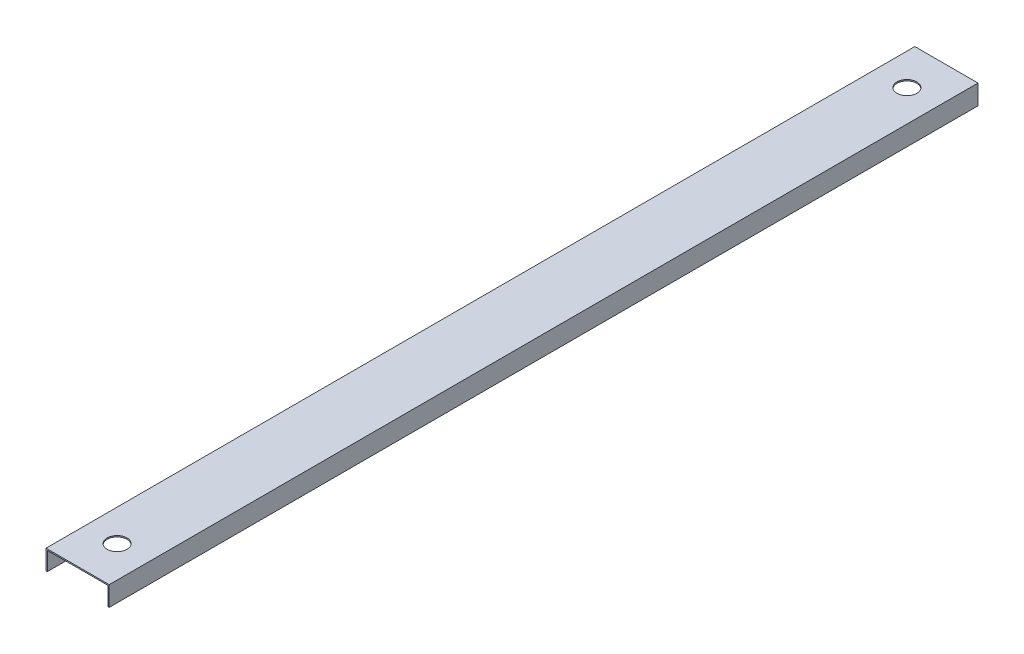
ISO-10303-21;
HEADER;
FILE_DESCRIPTION(('STEP AP214'),'2;1');
FILE_NAME('part.step','',(''),(''),'','','');
FILE_SCHEMA(('AUTOMOTIVE_DESIGN { 1 0 10303 214 1 1 1 1 }'));
ENDSEC;
DATA;
#1=APPLICATION_CONTEXT('core data for automotive mechanical design processes');
#2=APPLICATION_PROTOCOL_DEFINITION('international standard','automotive_design',2000,#1);
#3=PRODUCT_CONTEXT('',#1,'mechanical');
#4=PRODUCT('Part','Part','',(#3));
#5=PRODUCT_RELATED_PRODUCT_CATEGORY('part','',(#4));
#6=PRODUCT_DEFINITION_FORMATION('','',#4);
#7=PRODUCT_DEFINITION_CONTEXT('part definition',#1,'design');
#8=PRODUCT_DEFINITION('design','',#6,#7);
#9=PRODUCT_DEFINITION_SHAPE('','',#8);
#10=(LENGTH_UNIT() NAMED_UNIT(*) SI_UNIT(.MILLI.,.METRE.));
#11=(NAMED_UNIT(*) PLANE_ANGLE_UNIT() SI_UNIT($,.RADIAN.));
#12=(NAMED_UNIT(*) SI_UNIT($,.STERADIAN.) SOLID_ANGLE_UNIT());
#13=UNCERTAINTY_MEASURE_WITH_UNIT(LENGTH_MEASURE(1.E-05),#10,'distance_accuracy_value','');
#14=(GEOMETRIC_REPRESENTATION_CONTEXT(3) GLOBAL_UNCERTAINTY_ASSIGNED_CONTEXT((#13)) GLOBAL_UNIT_ASSIGNED_CONTEXT((#10,
#11,#12)) REPRESENTATION_CONTEXT('',''));
#15=CARTESIAN_POINT('',(0.,0.,0.));
#16=DIRECTION('',(0.,0.,1.));
#17=DIRECTION('',(1.,0.,0.));
#18=AXIS2_PLACEMENT_3D('',#15,#16,#17);
#19=CARTESIAN_POINT('',(-10.16,0.,-279.4));
#20=DIRECTION('',(0.,-1.,0.));
#21=DIRECTION('',(0.,0.,-1.));
#22=AXIS2_PLACEMENT_3D('',#19,#20,#21);
#23=PLANE('',#22);
#24=DIRECTION('',(1.,0.,0.));
#25=VECTOR('',#24,1.);
#26=CARTESIAN_POINT('',(-10.16,0.,0.));
#27=LINE('',#26,#25);
#28=CARTESIAN_POINT('',(-10.16,0.,0.));
#29=VERTEX_POINT('',#28);
#30=CARTESIAN_POINT('',(-9.7536,0.,0.));
#31=VERTEX_POINT('',#30);
#32=EDGE_CURVE('E132',#29,#31,#27,.T.);
#33=ORIENTED_EDGE('',*,*,#32,.F.);
#34=DIRECTION('',(0.,0.,1.));
#35=VECTOR('',#34,1.);
#36=CARTESIAN_POINT('',(-10.16,0.,-279.4));
#37=LINE('',#36,#35);
#38=CARTESIAN_POINT('',(-10.16,0.,-279.4));
#39=VERTEX_POINT('',#38);
#40=EDGE_CURVE('E11',#39,#29,#37,.T.);
#41=ORIENTED_EDGE('',*,*,#40,.F.);
#42=DIRECTION('',(1.,0.,0.));
#43=VECTOR('',#42,1.);
#44=CARTESIAN_POINT('',(-10.16,0.,-279.4));
#45=LINE('',#44,#43);
#46=CARTESIAN_POINT('',(-9.7536,0.,-279.4));
#47=VERTEX_POINT('',#46);
#48=EDGE_CURVE('E152',#39,#47,#45,.T.);
#49=ORIENTED_EDGE('',*,*,#48,.T.);
#50=DIRECTION('',(0.,0.,1.));
#51=VECTOR('',#50,1.);
#52=CARTESIAN_POINT('',(-9.7536,0.,-279.4));
#53=LINE('',#52,#51);
#54=EDGE_CURVE('E90',#47,#31,#53,.T.);
#55=ORIENTED_EDGE('',*,*,#54,.T.);
#56=EDGE_LOOP('',(#33,#41,#49,#55));
#57=FACE_BOUND('',#56,.T.);
#58=ADVANCED_FACE('F34',(#57),#23,.T.);
#59=CARTESIAN_POINT('',(-10.16,0.,-279.4));
#60=DIRECTION('',(-1.,0.,0.));
#61=DIRECTION('',(0.,0.,1.));
#62=AXIS2_PLACEMENT_3D('',#59,#60,#61);
#63=PLANE('',#62);
#64=DIRECTION('',(0.,-1.,0.));
#65=VECTOR('',#64,1.);
#66=CARTESIAN_POINT('',(-10.16,0.,0.));
#67=LINE('',#66,#65);
#68=CARTESIAN_POINT('',(-10.16,6.35,0.));
#69=VERTEX_POINT('',#68);
#70=EDGE_CURVE('E150',#69,#29,#67,.T.);
#71=ORIENTED_EDGE('',*,*,#70,.F.);
#72=DIRECTION('',(0.,0.,1.));
#73=VECTOR('',#72,1.);
#74=CARTESIAN_POINT('',(-10.16,6.35,-279.4));
#75=LINE('',#74,#73);
#76=CARTESIAN_POINT('',(-10.16,6.35,-279.4));
#77=VERTEX_POINT('',#76);
#78=EDGE_CURVE('E43',#77,#69,#75,.T.);
#79=ORIENTED_EDGE('',*,*,#78,.F.);
#80=DIRECTION('',(0.,-1.,0.));
#81=VECTOR('',#80,1.);
#82=CARTESIAN_POINT('',(-10.16,0.,-279.4));
#83=LINE('',#82,#81);
#84=EDGE_CURVE('E122',#77,#39,#83,.T.);
#85=ORIENTED_EDGE('',*,*,#84,.T.);
#86=ORIENTED_EDGE('',*,*,#40,.T.);
#87=EDGE_LOOP('',(#71,#79,#85,#86));
#88=FACE_BOUND('',#87,.T.);
#89=ADVANCED_FACE('F194',(#88),#63,.T.);
#90=CARTESIAN_POINT('',(-10.16,6.35,-279.4));
#91=DIRECTION('',(0.,1.,0.));
#92=DIRECTION('',(0.,0.,1.));
#93=AXIS2_PLACEMENT_3D('',#90,#91,#92);
#94=PLANE('',#93);
#95=CARTESIAN_POINT('',(0.,6.35,-266.7));
#96=DIRECTION('',(0.,1.,0.));
#97=DIRECTION('',(0.,0.,1.));
#98=AXIS2_PLACEMENT_3D('',#95,#96,#97);
#99=CIRCLE('',#98,3.18770000000001);
#100=CARTESIAN_POINT('',(0.,6.35,-263.5123));
#101=VERTEX_POINT('',#100);
#102=EDGE_CURVE('E164',#101,#101,#99,.T.);
#103=ORIENTED_EDGE('',*,*,#102,.F.);
#104=EDGE_LOOP('',(#103));
#105=FACE_BOUND('',#104,.T.);
#106=CARTESIAN_POINT('',(0.,6.35,-12.7));
#107=DIRECTION('',(0.,1.,0.));
#108=DIRECTION('',(0.,0.,1.));
#109=AXIS2_PLACEMENT_3D('',#106,#107,#108);
#110=CIRCLE('',#109,3.1877);
#111=CARTESIAN_POINT('',(0.,6.35,-9.5123));
#112=VERTEX_POINT('',#111);
#113=EDGE_CURVE('E169',#112,#112,#110,.T.);
#114=ORIENTED_EDGE('',*,*,#113,.F.);
#115=EDGE_LOOP('',(#114));
#116=FACE_BOUND('',#115,.T.);
#117=DIRECTION('',(-1.,0.,0.));
#118=VECTOR('',#117,1.);
#119=CARTESIAN_POINT('',(-10.16,6.35,0.));
#120=LINE('',#119,#118);
#121=CARTESIAN_POINT('',(10.16,6.35,0.));
#122=VERTEX_POINT('',#121);
#123=EDGE_CURVE('E109',#122,#69,#120,.T.);
#124=ORIENTED_EDGE('',*,*,#123,.F.);
#125=DIRECTION('',(0.,0.,1.));
#126=VECTOR('',#125,1.);
#127=CARTESIAN_POINT('',(10.16,6.35,-279.4));
#128=LINE('',#127,#126);
#129=CARTESIAN_POINT('',(10.16,6.35,-279.4));
#130=VERTEX_POINT('',#129);
#131=EDGE_CURVE('E104',#130,#122,#128,.T.);
#132=ORIENTED_EDGE('',*,*,#131,.F.);
#133=DIRECTION('',(-1.,0.,0.));
#134=VECTOR('',#133,1.);
#135=CARTESIAN_POINT('',(-10.16,6.35,-279.4));
#136=LINE('',#135,#134);
#137=EDGE_CURVE('E107',#130,#77,#136,.T.);
#138=ORIENTED_EDGE('',*,*,#137,.T.);
#139=ORIENTED_EDGE('',*,*,#78,.T.);
#140=EDGE_LOOP('',(#124,#132,#138,#139));
#141=FACE_BOUND('',#140,.T.);
#142=ADVANCED_FACE('F106',(#105,#116,#141),#94,.T.);
#143=CARTESIAN_POINT('',(10.16,6.35,-279.4));
#144=DIRECTION('',(1.,0.,0.));
#145=DIRECTION('',(0.,1.,0.));
#146=AXIS2_PLACEMENT_3D('',#143,#144,#145);
#147=PLANE('',#146);
#148=DIRECTION('',(0.,1.,0.));
#149=VECTOR('',#148,1.);
#150=CARTESIAN_POINT('',(10.16,6.35,0.));
#151=LINE('',#150,#149);
#152=CARTESIAN_POINT('',(10.16,0.,0.));
#153=VERTEX_POINT('',#152);
#154=EDGE_CURVE('E147',#153,#122,#151,.T.);
#155=ORIENTED_EDGE('',*,*,#154,.F.);
#156=DIRECTION('',(0.,0.,1.));
#157=VECTOR('',#156,1.);
#158=CARTESIAN_POINT('',(10.16,0.,-279.4));
#159=LINE('',#158,#157);
#160=CARTESIAN_POINT('',(10.16,0.,-279.4));
#161=VERTEX_POINT('',#160);
#162=EDGE_CURVE('E114',#161,#153,#159,.T.);
#163=ORIENTED_EDGE('',*,*,#162,.F.);
#164=DIRECTION('',(0.,1.,0.));
#165=VECTOR('',#164,1.);
#166=CARTESIAN_POINT('',(10.16,6.35,-279.4));
#167=LINE('',#166,#165);
#168=EDGE_CURVE('E120',#161,#130,#167,.T.);
#169=ORIENTED_EDGE('',*,*,#168,.T.);
#170=ORIENTED_EDGE('',*,*,#131,.T.);
#171=EDGE_LOOP('',(#155,#163,#169,#170));
#172=FACE_BOUND('',#171,.T.);
#173=ADVANCED_FACE('F124',(#172),#147,.T.);
#174=CARTESIAN_POINT('',(10.16,0.,-279.4));
#175=DIRECTION('',(0.,-1.,0.));
#176=DIRECTION('',(0.,0.,-1.));
#177=AXIS2_PLACEMENT_3D('',#174,#175,#176);
#178=PLANE('',#177);
#179=DIRECTION('',(1.,0.,0.));
#180=VECTOR('',#179,1.);
#181=CARTESIAN_POINT('',(10.16,0.,0.));
#182=LINE('',#181,#180);
#183=CARTESIAN_POINT('',(9.7536,0.,0.));
#184=VERTEX_POINT('',#183);
#185=EDGE_CURVE('E144',#184,#153,#182,.T.);
#186=ORIENTED_EDGE('',*,*,#185,.F.);
#187=DIRECTION('',(0.,0.,1.));
#188=VECTOR('',#187,1.);
#189=CARTESIAN_POINT('',(9.7536,0.,-279.4));
#190=LINE('',#189,#188);
#191=CARTESIAN_POINT('',(9.7536,0.,-279.4));
#192=VERTEX_POINT('',#191);
#193=EDGE_CURVE('E156',#192,#184,#190,.T.);
#194=ORIENTED_EDGE('',*,*,#193,.F.);
#195=DIRECTION('',(1.,0.,0.));
#196=VECTOR('',#195,1.);
#197=CARTESIAN_POINT('',(10.16,0.,-279.4));
#198=LINE('',#197,#196);
#199=EDGE_CURVE('E125',#192,#161,#198,.T.);
#200=ORIENTED_EDGE('',*,*,#199,.T.);
#201=ORIENTED_EDGE('',*,*,#162,.T.);
#202=EDGE_LOOP('',(#186,#194,#200,#201));
#203=FACE_BOUND('',#202,.T.);
#204=ADVANCED_FACE('F208',(#203),#178,.T.);
#205=CARTESIAN_POINT('',(9.7536,5.9436,-279.4));
#206=DIRECTION('',(-1.,0.,0.));
#207=DIRECTION('',(0.,0.,1.));
#208=AXIS2_PLACEMENT_3D('',#205,#206,#207);
#209=PLANE('',#208);
#210=DIRECTION('',(0.,-1.,0.));
#211=VECTOR('',#210,1.);
#212=CARTESIAN_POINT('',(9.7536,5.9436,0.));
#213=LINE('',#212,#211);
#214=CARTESIAN_POINT('',(9.7536,5.9436,0.));
#215=VERTEX_POINT('',#214);
#216=EDGE_CURVE('E141',#215,#184,#213,.T.);
#217=ORIENTED_EDGE('',*,*,#216,.F.);
#218=DIRECTION('',(0.,0.,1.));
#219=VECTOR('',#218,1.);
#220=CARTESIAN_POINT('',(9.7536,5.9436,-279.4));
#221=LINE('',#220,#219);
#222=CARTESIAN_POINT('',(9.7536,5.9436,-279.4));
#223=VERTEX_POINT('',#222);
#224=EDGE_CURVE('E158',#223,#215,#221,.T.);
#225=ORIENTED_EDGE('',*,*,#224,.F.);
#226=DIRECTION('',(0.,-1.,0.));
#227=VECTOR('',#226,1.);
#228=CARTESIAN_POINT('',(9.7536,5.9436,-279.4));
#229=LINE('',#228,#227);
#230=EDGE_CURVE('E127',#223,#192,#229,.T.);
#231=ORIENTED_EDGE('',*,*,#230,.T.);
#232=ORIENTED_EDGE('',*,*,#193,.T.);
#233=EDGE_LOOP('',(#217,#225,#231,#232));
#234=FACE_BOUND('',#233,.T.);
#235=ADVANCED_FACE('F185',(#234),#209,.T.);
#236=CARTESIAN_POINT('',(-9.7536,5.9436,-279.4));
#237=DIRECTION('',(0.,-1.,0.));
#238=DIRECTION('',(0.,0.,-1.));
#239=AXIS2_PLACEMENT_3D('',#236,#237,#238);
#240=PLANE('',#239);
#241=CARTESIAN_POINT('',(0.,5.9436,-266.7));
#242=DIRECTION('',(0.,-1.,0.));
#243=DIRECTION('',(0.,0.,-1.));
#244=AXIS2_PLACEMENT_3D('',#241,#242,#243);
#245=CIRCLE('',#244,3.18770000000001);
#246=CARTESIAN_POINT('',(0.,5.9436,-269.8877));
#247=VERTEX_POINT('',#246);
#248=EDGE_CURVE('E37',#247,#247,#245,.T.);
#249=ORIENTED_EDGE('',*,*,#248,.F.);
#250=EDGE_LOOP('',(#249));
#251=FACE_BOUND('',#250,.T.);
#252=CARTESIAN_POINT('',(0.,5.9436,-12.7));
#253=DIRECTION('',(0.,-1.,0.));
#254=DIRECTION('',(0.,0.,-1.));
#255=AXIS2_PLACEMENT_3D('',#252,#253,#254);
#256=CIRCLE('',#255,3.1877);
#257=CARTESIAN_POINT('',(0.,5.9436,-15.8877));
#258=VERTEX_POINT('',#257);
#259=EDGE_CURVE('E162',#258,#258,#256,.T.);
#260=ORIENTED_EDGE('',*,*,#259,.F.);
#261=EDGE_LOOP('',(#260));
#262=FACE_BOUND('',#261,.T.);
#263=DIRECTION('',(1.,0.,0.));
#264=VECTOR('',#263,1.);
#265=CARTESIAN_POINT('',(-9.7536,5.9436,0.));
#266=LINE('',#265,#264);
#267=CARTESIAN_POINT('',(-9.7536,5.9436,0.));
#268=VERTEX_POINT('',#267);
#269=EDGE_CURVE('E138',#268,#215,#266,.T.);
#270=ORIENTED_EDGE('',*,*,#269,.F.);
#271=DIRECTION('',(0.,0.,1.));
#272=VECTOR('',#271,1.);
#273=CARTESIAN_POINT('',(-9.7536,5.9436,-279.4));
#274=LINE('',#273,#272);
#275=CARTESIAN_POINT('',(-9.7536,5.9436,-279.4));
#276=VERTEX_POINT('',#275);
#277=EDGE_CURVE('E160',#276,#268,#274,.T.);
#278=ORIENTED_EDGE('',*,*,#277,.F.);
#279=DIRECTION('',(1.,0.,0.));
#280=VECTOR('',#279,1.);
#281=CARTESIAN_POINT('',(-9.7536,5.9436,-279.4));
#282=LINE('',#281,#280);
#283=EDGE_CURVE('E179',#276,#223,#282,.T.);
#284=ORIENTED_EDGE('',*,*,#283,.T.);
#285=ORIENTED_EDGE('',*,*,#224,.T.);
#286=EDGE_LOOP('',(#270,#278,#284,#285));
#287=FACE_BOUND('',#286,.T.);
#288=ADVANCED_FACE('F190',(#251,#262,#287),#240,.T.);
#289=CARTESIAN_POINT('',(-9.7536,0.,-279.4));
#290=DIRECTION('',(1.,0.,0.));
#291=DIRECTION('',(0.,0.,-1.));
#292=AXIS2_PLACEMENT_3D('',#289,#290,#291);
#293=PLANE('',#292);
#294=DIRECTION('',(0.,1.,0.));
#295=VECTOR('',#294,1.);
#296=CARTESIAN_POINT('',(-9.7536,0.,0.));
#297=LINE('',#296,#295);
#298=EDGE_CURVE('E135',#31,#268,#297,.T.);
#299=ORIENTED_EDGE('',*,*,#298,.F.);
#300=ORIENTED_EDGE('',*,*,#54,.F.);
#301=DIRECTION('',(0.,1.,0.));
#302=VECTOR('',#301,1.);
#303=CARTESIAN_POINT('',(-9.7536,0.,-279.4));
#304=LINE('',#303,#302);
#305=EDGE_CURVE('E177',#47,#276,#304,.T.);
#306=ORIENTED_EDGE('',*,*,#305,.T.);
#307=ORIENTED_EDGE('',*,*,#277,.T.);
#308=EDGE_LOOP('',(#299,#300,#306,#307));
#309=FACE_BOUND('',#308,.T.);
#310=ADVANCED_FACE('F191',(#309),#293,.T.);
#311=CARTESIAN_POINT('',(0.,0.,-279.4));
#312=DIRECTION('',(0.,0.,1.));
#313=DIRECTION('',(1.,0.,0.));
#314=AXIS2_PLACEMENT_3D('',#311,#312,#313);
#315=PLANE('',#314);
#316=ORIENTED_EDGE('',*,*,#48,.F.);
#317=ORIENTED_EDGE('',*,*,#84,.F.);
#318=ORIENTED_EDGE('',*,*,#137,.F.);
#319=ORIENTED_EDGE('',*,*,#168,.F.);
#320=ORIENTED_EDGE('',*,*,#199,.F.);
#321=ORIENTED_EDGE('',*,*,#230,.F.);
#322=ORIENTED_EDGE('',*,*,#283,.F.);
#323=ORIENTED_EDGE('',*,*,#305,.F.);
#324=EDGE_LOOP('',(#316,#317,#318,#319,#320,#321,#322,#323));
#325=FACE_BOUND('',#324,.T.);
#326=ADVANCED_FACE('F118',(#325),#315,.F.);
#327=CARTESIAN_POINT('',(0.,0.,0.));
#328=DIRECTION('',(0.,0.,1.));
#329=DIRECTION('',(1.,0.,0.));
#330=AXIS2_PLACEMENT_3D('',#327,#328,#329);
#331=PLANE('',#330);
#332=ORIENTED_EDGE('',*,*,#32,.T.);
#333=ORIENTED_EDGE('',*,*,#298,.T.);
#334=ORIENTED_EDGE('',*,*,#269,.T.);
#335=ORIENTED_EDGE('',*,*,#216,.T.);
#336=ORIENTED_EDGE('',*,*,#185,.T.);
#337=ORIENTED_EDGE('',*,*,#154,.T.);
#338=ORIENTED_EDGE('',*,*,#123,.T.);
#339=ORIENTED_EDGE('',*,*,#70,.T.);
#340=EDGE_LOOP('',(#332,#333,#334,#335,#336,#337,#338,#339));
#341=FACE_BOUND('',#340,.T.);
#342=ADVANCED_FACE('F193',(#341),#331,.T.);
#343=CARTESIAN_POINT('',(0.,0.,-12.7));
#344=DIRECTION('',(0.,1.,0.));
#345=DIRECTION('',(0.,0.,1.));
#346=AXIS2_PLACEMENT_3D('',#343,#344,#345);
#347=CYLINDRICAL_SURFACE('',#346,3.1877);
#348=ORIENTED_EDGE('',*,*,#259,.T.);
#349=EDGE_LOOP('',(#348));
#350=FACE_BOUND('',#349,.T.);
#351=ORIENTED_EDGE('',*,*,#113,.T.);
#352=EDGE_LOOP('',(#351));
#353=FACE_BOUND('',#352,.T.);
#354=ADVANCED_FACE('F223',(#350,#353),#347,.F.);
#355=CARTESIAN_POINT('',(0.,0.,-266.7));
#356=DIRECTION('',(0.,1.,0.));
#357=DIRECTION('',(0.,0.,1.));
#358=AXIS2_PLACEMENT_3D('',#355,#356,#357);
#359=CYLINDRICAL_SURFACE('',#358,3.18770000000001);
#360=ORIENTED_EDGE('',*,*,#248,.T.);
#361=EDGE_LOOP('',(#360));
#362=FACE_BOUND('',#361,.T.);
#363=ORIENTED_EDGE('',*,*,#102,.T.);
#364=EDGE_LOOP('',(#363));
#365=FACE_BOUND('',#364,.T.);
#366=ADVANCED_FACE('F227',(#362,#365),#359,.F.);
#367=CLOSED_SHELL('',(#58,#89,#142,#173,#204,#235,#288,#310,#326,#342,#354,#366));
#368=MANIFOLD_SOLID_BREP('B2',#367);
#369=ADVANCED_BREP_SHAPE_REPRESENTATION('',(#18,#368),#14);
#370=SHAPE_DEFINITION_REPRESENTATION(#9,#369);
ENDSEC;
END-ISO-10303-21;
